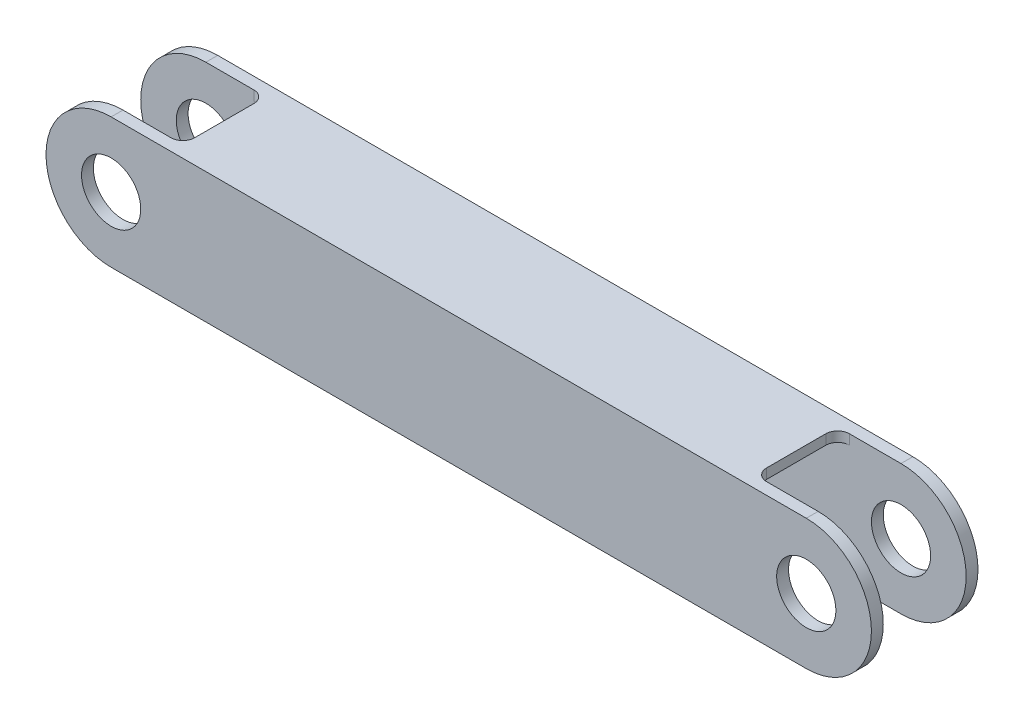
ISO-10303-21;
HEADER;
FILE_DESCRIPTION(('STEP AP214'),'2;1');
FILE_NAME('part.step','',(''),(''),'','','');
FILE_SCHEMA(('AUTOMOTIVE_DESIGN { 1 0 10303 214 1 1 1 1 }'));
ENDSEC;
DATA;
#1=APPLICATION_CONTEXT('core data for automotive mechanical design processes');
#2=APPLICATION_PROTOCOL_DEFINITION('international standard','automotive_design',2000,#1);
#3=PRODUCT_CONTEXT('',#1,'mechanical');
#4=PRODUCT('Part','Part','',(#3));
#5=PRODUCT_RELATED_PRODUCT_CATEGORY('part','',(#4));
#6=PRODUCT_DEFINITION_FORMATION('','',#4);
#7=PRODUCT_DEFINITION_CONTEXT('part definition',#1,'design');
#8=PRODUCT_DEFINITION('design','',#6,#7);
#9=PRODUCT_DEFINITION_SHAPE('','',#8);
#10=(LENGTH_UNIT() NAMED_UNIT(*) SI_UNIT(.MILLI.,.METRE.));
#11=(NAMED_UNIT(*) PLANE_ANGLE_UNIT() SI_UNIT($,.RADIAN.));
#12=(NAMED_UNIT(*) SI_UNIT($,.STERADIAN.) SOLID_ANGLE_UNIT());
#13=UNCERTAINTY_MEASURE_WITH_UNIT(LENGTH_MEASURE(1.E-05),#10,'distance_accuracy_value','');
#14=(GEOMETRIC_REPRESENTATION_CONTEXT(3) GLOBAL_UNCERTAINTY_ASSIGNED_CONTEXT((#13)) GLOBAL_UNIT_ASSIGNED_CONTEXT((#10,
#11,#12)) REPRESENTATION_CONTEXT('',''));
#15=CARTESIAN_POINT('',(0.,0.,0.));
#16=DIRECTION('',(0.,0.,1.));
#17=DIRECTION('',(1.,0.,0.));
#18=AXIS2_PLACEMENT_3D('',#15,#16,#17);
#19=CARTESIAN_POINT('',(58.7,11.,2.));
#20=DIRECTION('',(0.,0.,1.));
#21=DIRECTION('',(1.,0.,0.));
#22=AXIS2_PLACEMENT_3D('',#19,#20,#21);
#23=PLANE('',#22);
#24=DIRECTION('',(-1.,0.,0.));
#25=VECTOR('',#24,1.);
#26=CARTESIAN_POINT('',(-58.7,22.,2.));
#27=LINE('',#26,#25);
#28=CARTESIAN_POINT('',(58.7,22.,2.));
#29=VERTEX_POINT('',#28);
#30=CARTESIAN_POINT('',(49.9877897777614,22.,2.));
#31=VERTEX_POINT('',#30);
#32=EDGE_CURVE('E232',#29,#31,#27,.T.);
#33=ORIENTED_EDGE('',*,*,#32,.T.);
#34=DIRECTION('',(0.,1.,0.));
#35=VECTOR('',#34,1.);
#36=CARTESIAN_POINT('',(49.9877897777614,11.,2.));
#37=LINE('',#36,#35);
#38=CARTESIAN_POINT('',(49.9877897777614,20.3174261878141,2.));
#39=VERTEX_POINT('',#38);
#40=EDGE_CURVE('E269',#31,#39,#37,.F.);
#41=ORIENTED_EDGE('',*,*,#40,.T.);
#42=DIRECTION('',(1.,0.,0.));
#43=VECTOR('',#42,1.);
#44=CARTESIAN_POINT('',(-48.5967718815401,20.3174261878141,2.));
#45=LINE('',#44,#43);
#46=CARTESIAN_POINT('',(-50.5967718815401,20.3174261878141,2.));
#47=VERTEX_POINT('',#46);
#48=EDGE_CURVE('E163',#47,#39,#45,.T.);
#49=ORIENTED_EDGE('',*,*,#48,.F.);
#50=DIRECTION('',(0.,-1.,0.));
#51=VECTOR('',#50,1.);
#52=CARTESIAN_POINT('',(-50.5967718815401,11.,2.));
#53=LINE('',#52,#51);
#54=CARTESIAN_POINT('',(-50.5967718815401,22.,2.));
#55=VERTEX_POINT('',#54);
#56=EDGE_CURVE('E267',#47,#55,#53,.F.);
#57=ORIENTED_EDGE('',*,*,#56,.T.);
#58=CARTESIAN_POINT('',(-58.7,22.,2.));
#59=VERTEX_POINT('',#58);
#60=EDGE_CURVE('E230',#55,#59,#27,.T.);
#61=ORIENTED_EDGE('',*,*,#60,.T.);
#62=CARTESIAN_POINT('',(-58.7,11.,2.));
#63=DIRECTION('',(0.,0.,1.));
#64=DIRECTION('',(1.,0.,0.));
#65=AXIS2_PLACEMENT_3D('',#62,#63,#64);
#66=CIRCLE('',#65,11.);
#67=CARTESIAN_POINT('',(-58.7,0.,2.));
#68=VERTEX_POINT('',#67);
#69=EDGE_CURVE('E235',#59,#68,#66,.T.);
#70=ORIENTED_EDGE('',*,*,#69,.T.);
#71=DIRECTION('',(1.,0.,0.));
#72=VECTOR('',#71,1.);
#73=CARTESIAN_POINT('',(-58.7,0.,2.));
#74=LINE('',#73,#72);
#75=CARTESIAN_POINT('',(58.7,0.,2.));
#76=VERTEX_POINT('',#75);
#77=EDGE_CURVE('E237',#68,#76,#74,.T.);
#78=ORIENTED_EDGE('',*,*,#77,.T.);
#79=CARTESIAN_POINT('',(58.7,11.,2.));
#80=DIRECTION('',(0.,0.,1.));
#81=DIRECTION('',(1.,0.,0.));
#82=AXIS2_PLACEMENT_3D('',#79,#80,#81);
#83=CIRCLE('',#82,11.);
#84=EDGE_CURVE('E227',#76,#29,#83,.T.);
#85=ORIENTED_EDGE('',*,*,#84,.T.);
#86=EDGE_LOOP('',(#33,#41,#49,#57,#61,#70,#78,#85));
#87=FACE_BOUND('',#86,.T.);
#88=CARTESIAN_POINT('',(-58.7,11.,2.));
#89=DIRECTION('',(0.,0.,1.));
#90=DIRECTION('',(1.,0.,0.));
#91=AXIS2_PLACEMENT_3D('',#88,#89,#90);
#92=CIRCLE('',#91,5.);
#93=CARTESIAN_POINT('',(-53.7,11.,2.));
#94=VERTEX_POINT('',#93);
#95=EDGE_CURVE('E221',#94,#94,#92,.T.);
#96=ORIENTED_EDGE('',*,*,#95,.F.);
#97=EDGE_LOOP('',(#96));
#98=FACE_BOUND('',#97,.T.);
#99=CARTESIAN_POINT('',(58.7,11.,2.));
#100=DIRECTION('',(0.,0.,1.));
#101=DIRECTION('',(1.,0.,0.));
#102=AXIS2_PLACEMENT_3D('',#99,#100,#101);
#103=CIRCLE('',#102,5.);
#104=CARTESIAN_POINT('',(63.7,11.,2.));
#105=VERTEX_POINT('',#104);
#106=EDGE_CURVE('E215',#105,#105,#103,.T.);
#107=ORIENTED_EDGE('',*,*,#106,.F.);
#108=EDGE_LOOP('',(#107));
#109=FACE_BOUND('',#108,.T.);
#110=ADVANCED_FACE('F41',(#87,#98,#109),#23,.T.);
#111=CARTESIAN_POINT('',(58.7,11.,0.));
#112=DIRECTION('',(0.,0.,1.));
#113=DIRECTION('',(1.,0.,0.));
#114=AXIS2_PLACEMENT_3D('',#111,#112,#113);
#115=PLANE('',#114);
#116=CARTESIAN_POINT('',(58.7,11.,0.));
#117=DIRECTION('',(0.,0.,1.));
#118=DIRECTION('',(1.,0.,0.));
#119=AXIS2_PLACEMENT_3D('',#116,#117,#118);
#120=CIRCLE('',#119,11.);
#121=CARTESIAN_POINT('',(58.7,0.,0.));
#122=VERTEX_POINT('',#121);
#123=CARTESIAN_POINT('',(58.7,22.,0.));
#124=VERTEX_POINT('',#123);
#125=EDGE_CURVE('E224',#122,#124,#120,.T.);
#126=ORIENTED_EDGE('',*,*,#125,.F.);
#127=DIRECTION('',(1.,0.,0.));
#128=VECTOR('',#127,1.);
#129=CARTESIAN_POINT('',(-58.7,0.,0.));
#130=LINE('',#129,#128);
#131=CARTESIAN_POINT('',(-58.7,0.,0.));
#132=VERTEX_POINT('',#131);
#133=EDGE_CURVE('E231',#132,#122,#130,.T.);
#134=ORIENTED_EDGE('',*,*,#133,.F.);
#135=CARTESIAN_POINT('',(-58.7,11.,0.));
#136=DIRECTION('',(0.,0.,1.));
#137=DIRECTION('',(1.,0.,0.));
#138=AXIS2_PLACEMENT_3D('',#135,#136,#137);
#139=CIRCLE('',#138,11.);
#140=CARTESIAN_POINT('',(-58.7,22.,0.));
#141=VERTEX_POINT('',#140);
#142=EDGE_CURVE('E244',#141,#132,#139,.T.);
#143=ORIENTED_EDGE('',*,*,#142,.F.);
#144=DIRECTION('',(-1.,0.,0.));
#145=VECTOR('',#144,1.);
#146=CARTESIAN_POINT('',(-58.7,22.,0.));
#147=LINE('',#146,#145);
#148=EDGE_CURVE('E242',#124,#141,#147,.T.);
#149=ORIENTED_EDGE('',*,*,#148,.F.);
#150=EDGE_LOOP('',(#126,#134,#143,#149));
#151=FACE_BOUND('',#150,.T.);
#152=CARTESIAN_POINT('',(-58.7,11.,0.));
#153=DIRECTION('',(0.,0.,1.));
#154=DIRECTION('',(1.,0.,0.));
#155=AXIS2_PLACEMENT_3D('',#152,#153,#154);
#156=CIRCLE('',#155,5.);
#157=CARTESIAN_POINT('',(-53.7,11.,0.));
#158=VERTEX_POINT('',#157);
#159=EDGE_CURVE('E218',#158,#158,#156,.T.);
#160=ORIENTED_EDGE('',*,*,#159,.T.);
#161=EDGE_LOOP('',(#160));
#162=FACE_BOUND('',#161,.T.);
#163=CARTESIAN_POINT('',(58.7,11.,0.));
#164=DIRECTION('',(0.,0.,1.));
#165=DIRECTION('',(1.,0.,0.));
#166=AXIS2_PLACEMENT_3D('',#163,#164,#165);
#167=CIRCLE('',#166,5.);
#168=CARTESIAN_POINT('',(63.7,11.,0.));
#169=VERTEX_POINT('',#168);
#170=EDGE_CURVE('E214',#169,#169,#167,.T.);
#171=ORIENTED_EDGE('',*,*,#170,.T.);
#172=EDGE_LOOP('',(#171));
#173=FACE_BOUND('',#172,.T.);
#174=ADVANCED_FACE('F358',(#151,#162,#173),#115,.F.);
#175=CARTESIAN_POINT('',(58.7,11.,2.));
#176=DIRECTION('',(0.,0.,-1.));
#177=DIRECTION('',(-1.,0.,0.));
#178=AXIS2_PLACEMENT_3D('',#175,#176,#177);
#179=CYLINDRICAL_SURFACE('',#178,11.);
#180=ORIENTED_EDGE('',*,*,#125,.T.);
#181=DIRECTION('',(0.,0.,-1.));
#182=VECTOR('',#181,1.);
#183=CARTESIAN_POINT('',(58.7,22.,2.));
#184=LINE('',#183,#182);
#185=EDGE_CURVE('E255',#29,#124,#184,.T.);
#186=ORIENTED_EDGE('',*,*,#185,.F.);
#187=ORIENTED_EDGE('',*,*,#84,.F.);
#188=DIRECTION('',(0.,0.,-1.));
#189=VECTOR('',#188,1.);
#190=CARTESIAN_POINT('',(58.7,0.,2.));
#191=LINE('',#190,#189);
#192=EDGE_CURVE('E239',#76,#122,#191,.T.);
#193=ORIENTED_EDGE('',*,*,#192,.T.);
#194=EDGE_LOOP('',(#180,#186,#187,#193));
#195=FACE_BOUND('',#194,.T.);
#196=ADVANCED_FACE('F311',(#195),#179,.T.);
#197=CARTESIAN_POINT('',(-58.7,22.,2.));
#198=DIRECTION('',(0.,-1.,0.));
#199=DIRECTION('',(1.,0.,0.));
#200=AXIS2_PLACEMENT_3D('',#197,#198,#199);
#201=PLANE('',#200);
#202=ORIENTED_EDGE('',*,*,#148,.T.);
#203=DIRECTION('',(0.,0.,-1.));
#204=VECTOR('',#203,1.);
#205=CARTESIAN_POINT('',(-58.7,22.,2.));
#206=LINE('',#205,#204);
#207=EDGE_CURVE('E252',#59,#141,#206,.T.);
#208=ORIENTED_EDGE('',*,*,#207,.F.);
#209=ORIENTED_EDGE('',*,*,#60,.F.);
#210=CARTESIAN_POINT('',(-50.5967718815401,22.,4.));
#211=DIRECTION('',(0.,-1.,0.));
#212=DIRECTION('',(1.,0.,0.));
#213=AXIS2_PLACEMENT_3D('',#210,#211,#212);
#214=CIRCLE('',#213,2.);
#215=CARTESIAN_POINT('',(-48.5967718815401,22.,4.));
#216=VERTEX_POINT('',#215);
#217=EDGE_CURVE('E11',#55,#216,#214,.T.);
#218=ORIENTED_EDGE('',*,*,#217,.T.);
#219=DIRECTION('',(0.,0.,-1.));
#220=VECTOR('',#219,1.);
#221=CARTESIAN_POINT('',(-48.5967718815401,22.,5.5));
#222=LINE('',#221,#220);
#223=CARTESIAN_POINT('',(-48.5967718815401,22.,14.));
#224=VERTEX_POINT('',#223);
#225=EDGE_CURVE('E203',#224,#216,#222,.T.);
#226=ORIENTED_EDGE('',*,*,#225,.F.);
#227=CARTESIAN_POINT('',(-50.5967718815401,22.,14.));
#228=DIRECTION('',(0.,-1.,0.));
#229=DIRECTION('',(1.,0.,0.));
#230=AXIS2_PLACEMENT_3D('',#227,#228,#229);
#231=CIRCLE('',#230,2.);
#232=CARTESIAN_POINT('',(-50.5967718815401,22.,16.));
#233=VERTEX_POINT('',#232);
#234=EDGE_CURVE('E287',#224,#233,#231,.T.);
#235=ORIENTED_EDGE('',*,*,#234,.T.);
#236=DIRECTION('',(-1.,0.,0.));
#237=VECTOR('',#236,1.);
#238=CARTESIAN_POINT('',(-58.7,22.,16.));
#239=LINE('',#238,#237);
#240=CARTESIAN_POINT('',(-58.7,22.,16.));
#241=VERTEX_POINT('',#240);
#242=EDGE_CURVE('E173',#233,#241,#239,.T.);
#243=ORIENTED_EDGE('',*,*,#242,.T.);
#244=DIRECTION('',(0.,0.,1.));
#245=VECTOR('',#244,1.);
#246=CARTESIAN_POINT('',(-58.7,22.,16.));
#247=LINE('',#246,#245);
#248=CARTESIAN_POINT('',(-58.7,22.,18.));
#249=VERTEX_POINT('',#248);
#250=EDGE_CURVE('E164',#241,#249,#247,.T.);
#251=ORIENTED_EDGE('',*,*,#250,.T.);
#252=DIRECTION('',(-1.,0.,0.));
#253=VECTOR('',#252,1.);
#254=CARTESIAN_POINT('',(-58.7,22.,18.));
#255=LINE('',#254,#253);
#256=CARTESIAN_POINT('',(58.7,22.,18.));
#257=VERTEX_POINT('',#256);
#258=EDGE_CURVE('E159',#257,#249,#255,.T.);
#259=ORIENTED_EDGE('',*,*,#258,.F.);
#260=DIRECTION('',(0.,0.,1.));
#261=VECTOR('',#260,1.);
#262=CARTESIAN_POINT('',(58.7,22.,16.));
#263=LINE('',#262,#261);
#264=CARTESIAN_POINT('',(58.7,22.,16.));
#265=VERTEX_POINT('',#264);
#266=EDGE_CURVE('E153',#265,#257,#263,.T.);
#267=ORIENTED_EDGE('',*,*,#266,.F.);
#268=CARTESIAN_POINT('',(49.9877897777614,22.,16.));
#269=VERTEX_POINT('',#268);
#270=EDGE_CURVE('E157',#265,#269,#239,.T.);
#271=ORIENTED_EDGE('',*,*,#270,.T.);
#272=CARTESIAN_POINT('',(49.9877897777614,22.,14.));
#273=DIRECTION('',(0.,-1.,0.));
#274=DIRECTION('',(1.,0.,0.));
#275=AXIS2_PLACEMENT_3D('',#272,#273,#274);
#276=CIRCLE('',#275,2.);
#277=CARTESIAN_POINT('',(47.9877897777614,22.,14.));
#278=VERTEX_POINT('',#277);
#279=EDGE_CURVE('E276',#269,#278,#276,.T.);
#280=ORIENTED_EDGE('',*,*,#279,.T.);
#281=DIRECTION('',(0.,0.,-1.));
#282=VECTOR('',#281,1.);
#283=CARTESIAN_POINT('',(47.9877897777614,22.,5.5));
#284=LINE('',#283,#282);
#285=CARTESIAN_POINT('',(47.9877897777614,22.,4.));
#286=VERTEX_POINT('',#285);
#287=EDGE_CURVE('E205',#278,#286,#284,.T.);
#288=ORIENTED_EDGE('',*,*,#287,.T.);
#289=CARTESIAN_POINT('',(49.9877897777614,22.,4.));
#290=DIRECTION('',(0.,-1.,0.));
#291=DIRECTION('',(1.,0.,0.));
#292=AXIS2_PLACEMENT_3D('',#289,#290,#291);
#293=CIRCLE('',#292,2.);
#294=EDGE_CURVE('E281',#286,#31,#293,.T.);
#295=ORIENTED_EDGE('',*,*,#294,.T.);
#296=ORIENTED_EDGE('',*,*,#32,.F.);
#297=ORIENTED_EDGE('',*,*,#185,.T.);
#298=EDGE_LOOP('',(#202,#208,#209,#218,#226,#235,#243,#251,#259,#267,#271,#280,#288,#295,#296,#297));
#299=FACE_BOUND('',#298,.T.);
#300=ADVANCED_FACE('F155',(#299),#201,.F.);
#301=CARTESIAN_POINT('',(-58.7,11.,2.));
#302=DIRECTION('',(0.,0.,-1.));
#303=DIRECTION('',(-1.,0.,0.));
#304=AXIS2_PLACEMENT_3D('',#301,#302,#303);
#305=CYLINDRICAL_SURFACE('',#304,11.);
#306=ORIENTED_EDGE('',*,*,#142,.T.);
#307=DIRECTION('',(0.,0.,-1.));
#308=VECTOR('',#307,1.);
#309=CARTESIAN_POINT('',(-58.7,0.,2.));
#310=LINE('',#309,#308);
#311=EDGE_CURVE('E249',#68,#132,#310,.T.);
#312=ORIENTED_EDGE('',*,*,#311,.F.);
#313=ORIENTED_EDGE('',*,*,#69,.F.);
#314=ORIENTED_EDGE('',*,*,#207,.T.);
#315=EDGE_LOOP('',(#306,#312,#313,#314));
#316=FACE_BOUND('',#315,.T.);
#317=ADVANCED_FACE('F301',(#316),#305,.T.);
#318=CARTESIAN_POINT('',(-58.7,0.,2.));
#319=DIRECTION('',(0.,1.,0.));
#320=DIRECTION('',(-1.,0.,0.));
#321=AXIS2_PLACEMENT_3D('',#318,#319,#320);
#322=PLANE('',#321);
#323=ORIENTED_EDGE('',*,*,#133,.T.);
#324=ORIENTED_EDGE('',*,*,#192,.F.);
#325=ORIENTED_EDGE('',*,*,#77,.F.);
#326=ORIENTED_EDGE('',*,*,#311,.T.);
#327=EDGE_LOOP('',(#323,#324,#325,#326));
#328=FACE_BOUND('',#327,.T.);
#329=ADVANCED_FACE('F307',(#328),#322,.F.);
#330=CARTESIAN_POINT('',(-58.7,11.,2.));
#331=DIRECTION('',(0.,0.,-1.));
#332=DIRECTION('',(-1.,0.,0.));
#333=AXIS2_PLACEMENT_3D('',#330,#331,#332);
#334=CYLINDRICAL_SURFACE('',#333,5.);
#335=ORIENTED_EDGE('',*,*,#95,.T.);
#336=EDGE_LOOP('',(#335));
#337=FACE_BOUND('',#336,.T.);
#338=ORIENTED_EDGE('',*,*,#159,.F.);
#339=EDGE_LOOP('',(#338));
#340=FACE_BOUND('',#339,.T.);
#341=ADVANCED_FACE('F368',(#337,#340),#334,.F.);
#342=CARTESIAN_POINT('',(58.7,11.,2.));
#343=DIRECTION('',(0.,0.,-1.));
#344=DIRECTION('',(-1.,0.,0.));
#345=AXIS2_PLACEMENT_3D('',#342,#343,#344);
#346=CYLINDRICAL_SURFACE('',#345,5.);
#347=ORIENTED_EDGE('',*,*,#106,.T.);
#348=EDGE_LOOP('',(#347));
#349=FACE_BOUND('',#348,.T.);
#350=ORIENTED_EDGE('',*,*,#170,.F.);
#351=EDGE_LOOP('',(#350));
#352=FACE_BOUND('',#351,.T.);
#353=ADVANCED_FACE('F477',(#349,#352),#346,.F.);
#354=CARTESIAN_POINT('',(-48.5967718815401,22.,5.5));
#355=DIRECTION('',(1.,0.,0.));
#356=DIRECTION('',(0.,0.,-1.));
#357=AXIS2_PLACEMENT_3D('',#354,#355,#356);
#358=PLANE('',#357);
#359=DIRECTION('',(0.,0.,-1.));
#360=VECTOR('',#359,1.);
#361=CARTESIAN_POINT('',(-48.5967718815401,20.3174261878141,5.5));
#362=LINE('',#361,#360);
#363=CARTESIAN_POINT('',(-48.5967718815401,20.3174261878141,14.));
#364=VERTEX_POINT('',#363);
#365=CARTESIAN_POINT('',(-48.5967718815401,20.3174261878141,4.));
#366=VERTEX_POINT('',#365);
#367=EDGE_CURVE('E211',#364,#366,#362,.T.);
#368=ORIENTED_EDGE('',*,*,#367,.F.);
#369=DIRECTION('',(0.,-1.,0.));
#370=VECTOR('',#369,1.);
#371=CARTESIAN_POINT('',(-48.5967718815401,22.,14.));
#372=LINE('',#371,#370);
#373=EDGE_CURVE('E61',#364,#224,#372,.F.);
#374=ORIENTED_EDGE('',*,*,#373,.T.);
#375=ORIENTED_EDGE('',*,*,#225,.T.);
#376=DIRECTION('',(0.,-1.,0.));
#377=VECTOR('',#376,1.);
#378=CARTESIAN_POINT('',(-48.5967718815401,22.,4.));
#379=LINE('',#378,#377);
#380=EDGE_CURVE('E272',#216,#366,#379,.T.);
#381=ORIENTED_EDGE('',*,*,#380,.T.);
#382=EDGE_LOOP('',(#368,#374,#375,#381));
#383=FACE_BOUND('',#382,.T.);
#384=ADVANCED_FACE('F470',(#383),#358,.F.);
#385=CARTESIAN_POINT('',(-48.5967718815401,20.3174261878141,5.5));
#386=DIRECTION('',(0.,1.,0.));
#387=DIRECTION('',(0.,0.,1.));
#388=AXIS2_PLACEMENT_3D('',#385,#386,#387);
#389=PLANE('',#388);
#390=ORIENTED_EDGE('',*,*,#48,.T.);
#391=CARTESIAN_POINT('',(49.9877897777614,20.3174261878141,4.));
#392=DIRECTION('',(0.,1.,0.));
#393=DIRECTION('',(0.,0.,1.));
#394=AXIS2_PLACEMENT_3D('',#391,#392,#393);
#395=CIRCLE('',#394,2.);
#396=CARTESIAN_POINT('',(47.9877897777614,20.3174261878141,4.));
#397=VERTEX_POINT('',#396);
#398=EDGE_CURVE('E283',#39,#397,#395,.T.);
#399=ORIENTED_EDGE('',*,*,#398,.T.);
#400=DIRECTION('',(0.,0.,-1.));
#401=VECTOR('',#400,1.);
#402=CARTESIAN_POINT('',(47.9877897777614,20.3174261878141,5.5));
#403=LINE('',#402,#401);
#404=CARTESIAN_POINT('',(47.9877897777614,20.3174261878141,14.));
#405=VERTEX_POINT('',#404);
#406=EDGE_CURVE('E208',#405,#397,#403,.T.);
#407=ORIENTED_EDGE('',*,*,#406,.F.);
#408=CARTESIAN_POINT('',(49.9877897777614,20.3174261878141,14.));
#409=DIRECTION('',(0.,1.,0.));
#410=DIRECTION('',(0.,0.,1.));
#411=AXIS2_PLACEMENT_3D('',#408,#409,#410);
#412=CIRCLE('',#411,2.);
#413=CARTESIAN_POINT('',(49.9877897777614,20.3174261878141,16.));
#414=VERTEX_POINT('',#413);
#415=EDGE_CURVE('E278',#405,#414,#412,.T.);
#416=ORIENTED_EDGE('',*,*,#415,.T.);
#417=DIRECTION('',(1.,0.,0.));
#418=VECTOR('',#417,1.);
#419=CARTESIAN_POINT('',(-48.5967718815401,20.3174261878141,16.));
#420=LINE('',#419,#418);
#421=CARTESIAN_POINT('',(-50.5967718815401,20.3174261878141,16.));
#422=VERTEX_POINT('',#421);
#423=EDGE_CURVE('E325',#422,#414,#420,.T.);
#424=ORIENTED_EDGE('',*,*,#423,.F.);
#425=CARTESIAN_POINT('',(-50.5967718815401,20.3174261878141,14.));
#426=DIRECTION('',(0.,1.,0.));
#427=DIRECTION('',(0.,0.,1.));
#428=AXIS2_PLACEMENT_3D('',#425,#426,#427);
#429=CIRCLE('',#428,2.);
#430=EDGE_CURVE('E285',#422,#364,#429,.T.);
#431=ORIENTED_EDGE('',*,*,#430,.T.);
#432=ORIENTED_EDGE('',*,*,#367,.T.);
#433=CARTESIAN_POINT('',(-50.5967718815401,20.3174261878141,4.));
#434=DIRECTION('',(0.,1.,0.));
#435=DIRECTION('',(0.,0.,1.));
#436=AXIS2_PLACEMENT_3D('',#433,#434,#435);
#437=CIRCLE('',#436,2.);
#438=EDGE_CURVE('E49',#366,#47,#437,.T.);
#439=ORIENTED_EDGE('',*,*,#438,.T.);
#440=EDGE_LOOP('',(#390,#399,#407,#416,#424,#431,#432,#439));
#441=FACE_BOUND('',#440,.T.);
#442=ADVANCED_FACE('F291',(#441),#389,.F.);
#443=CARTESIAN_POINT('',(47.9877897777614,22.,5.5));
#444=DIRECTION('',(-1.,0.,0.));
#445=DIRECTION('',(0.,0.,1.));
#446=AXIS2_PLACEMENT_3D('',#443,#444,#445);
#447=PLANE('',#446);
#448=ORIENTED_EDGE('',*,*,#287,.F.);
#449=DIRECTION('',(0.,1.,0.));
#450=VECTOR('',#449,1.);
#451=CARTESIAN_POINT('',(47.9877897777614,22.,14.));
#452=LINE('',#451,#450);
#453=EDGE_CURVE('E265',#278,#405,#452,.F.);
#454=ORIENTED_EDGE('',*,*,#453,.T.);
#455=ORIENTED_EDGE('',*,*,#406,.T.);
#456=DIRECTION('',(0.,1.,0.));
#457=VECTOR('',#456,1.);
#458=CARTESIAN_POINT('',(47.9877897777614,22.,4.));
#459=LINE('',#458,#457);
#460=EDGE_CURVE('E262',#397,#286,#459,.T.);
#461=ORIENTED_EDGE('',*,*,#460,.T.);
#462=EDGE_LOOP('',(#448,#454,#455,#461));
#463=FACE_BOUND('',#462,.T.);
#464=ADVANCED_FACE('F321',(#463),#447,.F.);
#465=CARTESIAN_POINT('',(58.7,11.,16.));
#466=DIRECTION('',(0.,0.,-1.));
#467=DIRECTION('',(1.,0.,0.));
#468=AXIS2_PLACEMENT_3D('',#465,#466,#467);
#469=PLANE('',#468);
#470=ORIENTED_EDGE('',*,*,#423,.T.);
#471=DIRECTION('',(0.,1.,0.));
#472=VECTOR('',#471,1.);
#473=CARTESIAN_POINT('',(49.9877897777614,11.,16.));
#474=LINE('',#473,#472);
#475=EDGE_CURVE('E180',#414,#269,#474,.T.);
#476=ORIENTED_EDGE('',*,*,#475,.T.);
#477=ORIENTED_EDGE('',*,*,#270,.F.);
#478=CARTESIAN_POINT('',(58.7,11.,16.));
#479=DIRECTION('',(0.,0.,1.));
#480=DIRECTION('',(1.,0.,0.));
#481=AXIS2_PLACEMENT_3D('',#478,#479,#480);
#482=CIRCLE('',#481,11.);
#483=CARTESIAN_POINT('',(58.7,0.,16.));
#484=VERTEX_POINT('',#483);
#485=EDGE_CURVE('E167',#484,#265,#482,.T.);
#486=ORIENTED_EDGE('',*,*,#485,.F.);
#487=DIRECTION('',(1.,0.,0.));
#488=VECTOR('',#487,1.);
#489=CARTESIAN_POINT('',(-58.7,0.,16.));
#490=LINE('',#489,#488);
#491=CARTESIAN_POINT('',(-58.7,0.,16.));
#492=VERTEX_POINT('',#491);
#493=EDGE_CURVE('E184',#492,#484,#490,.T.);
#494=ORIENTED_EDGE('',*,*,#493,.F.);
#495=CARTESIAN_POINT('',(-58.7,11.,16.));
#496=DIRECTION('',(0.,0.,1.));
#497=DIRECTION('',(1.,0.,0.));
#498=AXIS2_PLACEMENT_3D('',#495,#496,#497);
#499=CIRCLE('',#498,11.);
#500=EDGE_CURVE('E181',#241,#492,#499,.T.);
#501=ORIENTED_EDGE('',*,*,#500,.F.);
#502=ORIENTED_EDGE('',*,*,#242,.F.);
#503=DIRECTION('',(0.,-1.,0.));
#504=VECTOR('',#503,1.);
#505=CARTESIAN_POINT('',(-50.5967718815401,11.,16.));
#506=LINE('',#505,#504);
#507=EDGE_CURVE('E258',#233,#422,#506,.T.);
#508=ORIENTED_EDGE('',*,*,#507,.T.);
#509=EDGE_LOOP('',(#470,#476,#477,#486,#494,#501,#502,#508));
#510=FACE_BOUND('',#509,.T.);
#511=CARTESIAN_POINT('',(-58.7,11.,16.));
#512=DIRECTION('',(0.,0.,1.));
#513=DIRECTION('',(1.,0.,0.));
#514=AXIS2_PLACEMENT_3D('',#511,#512,#513);
#515=CIRCLE('',#514,5.);
#516=CARTESIAN_POINT('',(-53.7,11.,16.));
#517=VERTEX_POINT('',#516);
#518=EDGE_CURVE('E191',#517,#517,#515,.T.);
#519=ORIENTED_EDGE('',*,*,#518,.T.);
#520=EDGE_LOOP('',(#519));
#521=FACE_BOUND('',#520,.T.);
#522=CARTESIAN_POINT('',(58.7,11.,16.));
#523=DIRECTION('',(0.,0.,1.));
#524=DIRECTION('',(1.,0.,0.));
#525=AXIS2_PLACEMENT_3D('',#522,#523,#524);
#526=CIRCLE('',#525,5.);
#527=CARTESIAN_POINT('',(63.7,11.,16.));
#528=VERTEX_POINT('',#527);
#529=EDGE_CURVE('E584',#528,#528,#526,.T.);
#530=ORIENTED_EDGE('',*,*,#529,.T.);
#531=EDGE_LOOP('',(#530));
#532=FACE_BOUND('',#531,.T.);
#533=ADVANCED_FACE('F177',(#510,#521,#532),#469,.T.);
#534=CARTESIAN_POINT('',(58.7,11.,18.));
#535=DIRECTION('',(0.,0.,-1.));
#536=DIRECTION('',(1.,0.,0.));
#537=AXIS2_PLACEMENT_3D('',#534,#535,#536);
#538=PLANE('',#537);
#539=CARTESIAN_POINT('',(58.7,11.,18.));
#540=DIRECTION('',(0.,0.,1.));
#541=DIRECTION('',(1.,0.,0.));
#542=AXIS2_PLACEMENT_3D('',#539,#540,#541);
#543=CIRCLE('',#542,11.);
#544=CARTESIAN_POINT('',(58.7,0.,18.));
#545=VERTEX_POINT('',#544);
#546=EDGE_CURVE('E189',#545,#257,#543,.T.);
#547=ORIENTED_EDGE('',*,*,#546,.T.);
#548=ORIENTED_EDGE('',*,*,#258,.T.);
#549=CARTESIAN_POINT('',(-58.7,11.,18.));
#550=DIRECTION('',(0.,0.,1.));
#551=DIRECTION('',(1.,0.,0.));
#552=AXIS2_PLACEMENT_3D('',#549,#550,#551);
#553=CIRCLE('',#552,11.);
#554=CARTESIAN_POINT('',(-58.7,0.,18.));
#555=VERTEX_POINT('',#554);
#556=EDGE_CURVE('E193',#249,#555,#553,.T.);
#557=ORIENTED_EDGE('',*,*,#556,.T.);
#558=DIRECTION('',(1.,0.,0.));
#559=VECTOR('',#558,1.);
#560=CARTESIAN_POINT('',(-58.7,0.,18.));
#561=LINE('',#560,#559);
#562=EDGE_CURVE('E174',#555,#545,#561,.T.);
#563=ORIENTED_EDGE('',*,*,#562,.T.);
#564=EDGE_LOOP('',(#547,#548,#557,#563));
#565=FACE_BOUND('',#564,.T.);
#566=CARTESIAN_POINT('',(-58.7,11.,18.));
#567=DIRECTION('',(0.,0.,1.));
#568=DIRECTION('',(1.,0.,0.));
#569=AXIS2_PLACEMENT_3D('',#566,#567,#568);
#570=CIRCLE('',#569,5.);
#571=CARTESIAN_POINT('',(-53.7,11.,18.));
#572=VERTEX_POINT('',#571);
#573=EDGE_CURVE('E589',#572,#572,#570,.T.);
#574=ORIENTED_EDGE('',*,*,#573,.F.);
#575=EDGE_LOOP('',(#574));
#576=FACE_BOUND('',#575,.T.);
#577=CARTESIAN_POINT('',(58.7,11.,18.));
#578=DIRECTION('',(0.,0.,1.));
#579=DIRECTION('',(1.,0.,0.));
#580=AXIS2_PLACEMENT_3D('',#577,#578,#579);
#581=CIRCLE('',#580,5.);
#582=CARTESIAN_POINT('',(63.7,11.,18.));
#583=VERTEX_POINT('',#582);
#584=EDGE_CURVE('E327',#583,#583,#581,.T.);
#585=ORIENTED_EDGE('',*,*,#584,.F.);
#586=EDGE_LOOP('',(#585));
#587=FACE_BOUND('',#586,.T.);
#588=ADVANCED_FACE('F341',(#565,#576,#587),#538,.F.);
#589=CARTESIAN_POINT('',(58.7,11.,16.));
#590=DIRECTION('',(0.,0.,1.));
#591=DIRECTION('',(-1.,0.,0.));
#592=AXIS2_PLACEMENT_3D('',#589,#590,#591);
#593=CYLINDRICAL_SURFACE('',#592,11.);
#594=ORIENTED_EDGE('',*,*,#546,.F.);
#595=DIRECTION('',(0.,0.,1.));
#596=VECTOR('',#595,1.);
#597=CARTESIAN_POINT('',(58.7,0.,16.));
#598=LINE('',#597,#596);
#599=EDGE_CURVE('E169',#484,#545,#598,.T.);
#600=ORIENTED_EDGE('',*,*,#599,.F.);
#601=ORIENTED_EDGE('',*,*,#485,.T.);
#602=ORIENTED_EDGE('',*,*,#266,.T.);
#603=EDGE_LOOP('',(#594,#600,#601,#602));
#604=FACE_BOUND('',#603,.T.);
#605=ADVANCED_FACE('F168',(#604),#593,.T.);
#606=CARTESIAN_POINT('',(-58.7,11.,16.));
#607=DIRECTION('',(0.,0.,1.));
#608=DIRECTION('',(-1.,0.,0.));
#609=AXIS2_PLACEMENT_3D('',#606,#607,#608);
#610=CYLINDRICAL_SURFACE('',#609,11.);
#611=ORIENTED_EDGE('',*,*,#556,.F.);
#612=ORIENTED_EDGE('',*,*,#250,.F.);
#613=ORIENTED_EDGE('',*,*,#500,.T.);
#614=DIRECTION('',(0.,0.,1.));
#615=VECTOR('',#614,1.);
#616=CARTESIAN_POINT('',(-58.7,0.,16.));
#617=LINE('',#616,#615);
#618=EDGE_CURVE('E199',#492,#555,#617,.T.);
#619=ORIENTED_EDGE('',*,*,#618,.T.);
#620=EDGE_LOOP('',(#611,#612,#613,#619));
#621=FACE_BOUND('',#620,.T.);
#622=ADVANCED_FACE('F338',(#621),#610,.T.);
#623=CARTESIAN_POINT('',(-58.7,0.,16.));
#624=DIRECTION('',(0.,1.,0.));
#625=DIRECTION('',(-1.,0.,0.));
#626=AXIS2_PLACEMENT_3D('',#623,#624,#625);
#627=PLANE('',#626);
#628=ORIENTED_EDGE('',*,*,#562,.F.);
#629=ORIENTED_EDGE('',*,*,#618,.F.);
#630=ORIENTED_EDGE('',*,*,#493,.T.);
#631=ORIENTED_EDGE('',*,*,#599,.T.);
#632=EDGE_LOOP('',(#628,#629,#630,#631));
#633=FACE_BOUND('',#632,.T.);
#634=ADVANCED_FACE('F344',(#633),#627,.F.);
#635=CARTESIAN_POINT('',(-58.7,11.,16.));
#636=DIRECTION('',(0.,0.,1.));
#637=DIRECTION('',(-1.,0.,0.));
#638=AXIS2_PLACEMENT_3D('',#635,#636,#637);
#639=CYLINDRICAL_SURFACE('',#638,5.);
#640=ORIENTED_EDGE('',*,*,#518,.F.);
#641=EDGE_LOOP('',(#640));
#642=FACE_BOUND('',#641,.T.);
#643=ORIENTED_EDGE('',*,*,#573,.T.);
#644=EDGE_LOOP('',(#643));
#645=FACE_BOUND('',#644,.T.);
#646=ADVANCED_FACE('F346',(#642,#645),#639,.F.);
#647=CARTESIAN_POINT('',(58.7,11.,16.));
#648=DIRECTION('',(0.,0.,1.));
#649=DIRECTION('',(-1.,0.,0.));
#650=AXIS2_PLACEMENT_3D('',#647,#648,#649);
#651=CYLINDRICAL_SURFACE('',#650,5.);
#652=ORIENTED_EDGE('',*,*,#529,.F.);
#653=EDGE_LOOP('',(#652));
#654=FACE_BOUND('',#653,.T.);
#655=ORIENTED_EDGE('',*,*,#584,.T.);
#656=EDGE_LOOP('',(#655));
#657=FACE_BOUND('',#656,.T.);
#658=ADVANCED_FACE('F352',(#654,#657),#651,.F.);
#659=CARTESIAN_POINT('',(49.9877897777614,11.,14.));
#660=DIRECTION('',(0.,1.,0.));
#661=DIRECTION('',(0.,0.,1.));
#662=AXIS2_PLACEMENT_3D('',#659,#660,#661);
#663=CYLINDRICAL_SURFACE('',#662,2.);
#664=ORIENTED_EDGE('',*,*,#415,.F.);
#665=ORIENTED_EDGE('',*,*,#453,.F.);
#666=ORIENTED_EDGE('',*,*,#279,.F.);
#667=ORIENTED_EDGE('',*,*,#475,.F.);
#668=EDGE_LOOP('',(#664,#665,#666,#667));
#669=FACE_BOUND('',#668,.T.);
#670=ADVANCED_FACE('F324',(#669),#663,.F.);
#671=CARTESIAN_POINT('',(49.9877897777614,22.,4.));
#672=DIRECTION('',(0.,1.,0.));
#673=DIRECTION('',(0.,0.,1.));
#674=AXIS2_PLACEMENT_3D('',#671,#672,#673);
#675=CYLINDRICAL_SURFACE('',#674,2.);
#676=ORIENTED_EDGE('',*,*,#398,.F.);
#677=ORIENTED_EDGE('',*,*,#40,.F.);
#678=ORIENTED_EDGE('',*,*,#294,.F.);
#679=ORIENTED_EDGE('',*,*,#460,.F.);
#680=EDGE_LOOP('',(#676,#677,#678,#679));
#681=FACE_BOUND('',#680,.T.);
#682=ADVANCED_FACE('F315',(#681),#675,.F.);
#683=CARTESIAN_POINT('',(-50.5967718815401,11.,14.));
#684=DIRECTION('',(0.,-1.,0.));
#685=DIRECTION('',(0.,0.,-1.));
#686=AXIS2_PLACEMENT_3D('',#683,#684,#685);
#687=CYLINDRICAL_SURFACE('',#686,2.);
#688=ORIENTED_EDGE('',*,*,#234,.F.);
#689=ORIENTED_EDGE('',*,*,#373,.F.);
#690=ORIENTED_EDGE('',*,*,#430,.F.);
#691=ORIENTED_EDGE('',*,*,#507,.F.);
#692=EDGE_LOOP('',(#688,#689,#690,#691));
#693=FACE_BOUND('',#692,.T.);
#694=ADVANCED_FACE('F332',(#693),#687,.F.);
#695=CARTESIAN_POINT('',(-50.5967718815401,22.,4.));
#696=DIRECTION('',(0.,-1.,0.));
#697=DIRECTION('',(0.,0.,-1.));
#698=AXIS2_PLACEMENT_3D('',#695,#696,#697);
#699=CYLINDRICAL_SURFACE('',#698,2.);
#700=ORIENTED_EDGE('',*,*,#217,.F.);
#701=ORIENTED_EDGE('',*,*,#56,.F.);
#702=ORIENTED_EDGE('',*,*,#438,.F.);
#703=ORIENTED_EDGE('',*,*,#380,.F.);
#704=EDGE_LOOP('',(#700,#701,#702,#703));
#705=FACE_BOUND('',#704,.T.);
#706=ADVANCED_FACE('F43',(#705),#699,.F.);
#707=CLOSED_SHELL('',(#110,#174,#196,#300,#317,#329,#341,#353,#384,#442,#464,#533,#588,#605,
#622,#634,#646,#658,#670,#682,#694,#706));
#708=MANIFOLD_SOLID_BREP('B2',#707);
#709=ADVANCED_BREP_SHAPE_REPRESENTATION('',(#18,#708),#14);
#710=SHAPE_DEFINITION_REPRESENTATION(#9,#709);
ENDSEC;
END-ISO-10303-21;
